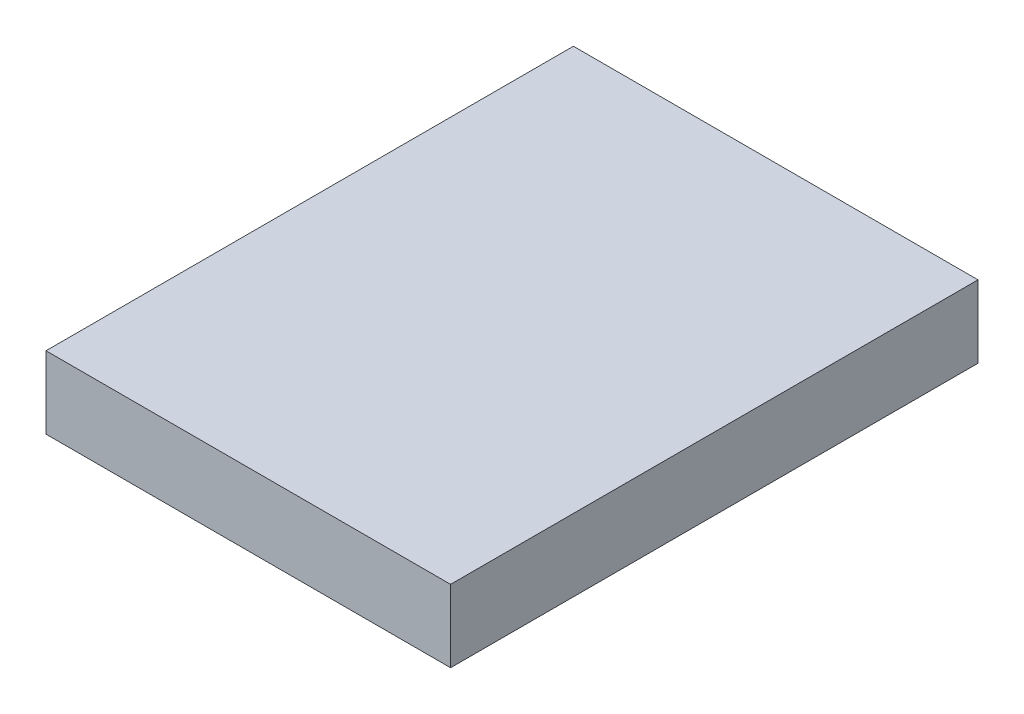
ISO-10303-21;
HEADER;
FILE_DESCRIPTION(('STEP AP214'),'2;1');
FILE_NAME('part.step','',(''),(''),'','','');
FILE_SCHEMA(('AUTOMOTIVE_DESIGN { 1 0 10303 214 1 1 1 1 }'));
ENDSEC;
DATA;
#1=APPLICATION_CONTEXT('core data for automotive mechanical design processes');
#2=APPLICATION_PROTOCOL_DEFINITION('international standard','automotive_design',2000,#1);
#3=PRODUCT_CONTEXT('',#1,'mechanical');
#4=PRODUCT('Part','Part','',(#3));
#5=PRODUCT_RELATED_PRODUCT_CATEGORY('part','',(#4));
#6=PRODUCT_DEFINITION_FORMATION('','',#4);
#7=PRODUCT_DEFINITION_CONTEXT('part definition',#1,'design');
#8=PRODUCT_DEFINITION('design','',#6,#7);
#9=PRODUCT_DEFINITION_SHAPE('','',#8);
#10=(LENGTH_UNIT() NAMED_UNIT(*) SI_UNIT(.MILLI.,.METRE.));
#11=(NAMED_UNIT(*) PLANE_ANGLE_UNIT() SI_UNIT($,.RADIAN.));
#12=(NAMED_UNIT(*) SI_UNIT($,.STERADIAN.) SOLID_ANGLE_UNIT());
#13=UNCERTAINTY_MEASURE_WITH_UNIT(LENGTH_MEASURE(1.E-05),#10,'distance_accuracy_value','');
#14=(GEOMETRIC_REPRESENTATION_CONTEXT(3) GLOBAL_UNCERTAINTY_ASSIGNED_CONTEXT((#13)) GLOBAL_UNIT_ASSIGNED_CONTEXT((#10,
#11,#12)) REPRESENTATION_CONTEXT('',''));
#15=CARTESIAN_POINT('',(0.,0.,0.));
#16=DIRECTION('',(0.,0.,1.));
#17=DIRECTION('',(1.,0.,0.));
#18=AXIS2_PLACEMENT_3D('',#15,#16,#17);
#19=CARTESIAN_POINT('',(0.,20.,0.));
#20=DIRECTION('',(1.,0.,0.));
#21=DIRECTION('',(0.,0.,-1.));
#22=AXIS2_PLACEMENT_3D('',#19,#20,#21);
#23=PLANE('',#22);
#24=DIRECTION('',(0.,0.,1.));
#25=VECTOR('',#24,1.);
#26=CARTESIAN_POINT('',(0.,0.,0.));
#27=LINE('',#26,#25);
#28=CARTESIAN_POINT('',(0.,0.,-146.));
#29=VERTEX_POINT('',#28);
#30=CARTESIAN_POINT('',(0.,0.,0.));
#31=VERTEX_POINT('',#30);
#32=EDGE_CURVE('E113',#29,#31,#27,.T.);
#33=ORIENTED_EDGE('',*,*,#32,.T.);
#34=DIRECTION('',(0.,-1.,0.));
#35=VECTOR('',#34,1.);
#36=CARTESIAN_POINT('',(0.,20.,0.));
#37=LINE('',#36,#35);
#38=CARTESIAN_POINT('',(0.,20.,0.));
#39=VERTEX_POINT('',#38);
#40=EDGE_CURVE('E11',#39,#31,#37,.T.);
#41=ORIENTED_EDGE('',*,*,#40,.F.);
#42=DIRECTION('',(0.,0.,1.));
#43=VECTOR('',#42,1.);
#44=CARTESIAN_POINT('',(0.,20.,0.));
#45=LINE('',#44,#43);
#46=CARTESIAN_POINT('',(0.,20.,-146.));
#47=VERTEX_POINT('',#46);
#48=EDGE_CURVE('E97',#47,#39,#45,.T.);
#49=ORIENTED_EDGE('',*,*,#48,.F.);
#50=DIRECTION('',(0.,-1.,0.));
#51=VECTOR('',#50,1.);
#52=CARTESIAN_POINT('',(0.,20.,-146.));
#53=LINE('',#52,#51);
#54=EDGE_CURVE('E109',#47,#29,#53,.T.);
#55=ORIENTED_EDGE('',*,*,#54,.T.);
#56=EDGE_LOOP('',(#33,#41,#49,#55));
#57=FACE_BOUND('',#56,.T.);
#58=ADVANCED_FACE('F45',(#57),#23,.F.);
#59=CARTESIAN_POINT('',(0.,20.,0.));
#60=DIRECTION('',(0.,0.,-1.));
#61=DIRECTION('',(-1.,0.,0.));
#62=AXIS2_PLACEMENT_3D('',#59,#60,#61);
#63=PLANE('',#62);
#64=DIRECTION('',(1.,0.,0.));
#65=VECTOR('',#64,1.);
#66=CARTESIAN_POINT('',(0.,0.,0.));
#67=LINE('',#66,#65);
#68=CARTESIAN_POINT('',(112.,0.,0.));
#69=VERTEX_POINT('',#68);
#70=EDGE_CURVE('E102',#31,#69,#67,.T.);
#71=ORIENTED_EDGE('',*,*,#70,.T.);
#72=DIRECTION('',(0.,-1.,0.));
#73=VECTOR('',#72,1.);
#74=CARTESIAN_POINT('',(112.,20.,0.));
#75=LINE('',#74,#73);
#76=CARTESIAN_POINT('',(112.,20.,0.));
#77=VERTEX_POINT('',#76);
#78=EDGE_CURVE('E54',#77,#69,#75,.T.);
#79=ORIENTED_EDGE('',*,*,#78,.F.);
#80=DIRECTION('',(1.,0.,0.));
#81=VECTOR('',#80,1.);
#82=CARTESIAN_POINT('',(0.,20.,0.));
#83=LINE('',#82,#81);
#84=EDGE_CURVE('E92',#39,#77,#83,.T.);
#85=ORIENTED_EDGE('',*,*,#84,.F.);
#86=ORIENTED_EDGE('',*,*,#40,.T.);
#87=EDGE_LOOP('',(#71,#79,#85,#86));
#88=FACE_BOUND('',#87,.T.);
#89=ADVANCED_FACE('F101',(#88),#63,.F.);
#90=CARTESIAN_POINT('',(112.,20.,0.));
#91=DIRECTION('',(-1.,0.,0.));
#92=DIRECTION('',(0.,0.,1.));
#93=AXIS2_PLACEMENT_3D('',#90,#91,#92);
#94=PLANE('',#93);
#95=DIRECTION('',(0.,0.,-1.));
#96=VECTOR('',#95,1.);
#97=CARTESIAN_POINT('',(112.,0.,0.));
#98=LINE('',#97,#96);
#99=CARTESIAN_POINT('',(112.,0.,-146.));
#100=VERTEX_POINT('',#99);
#101=EDGE_CURVE('E79',#69,#100,#98,.T.);
#102=ORIENTED_EDGE('',*,*,#101,.T.);
#103=DIRECTION('',(0.,-1.,0.));
#104=VECTOR('',#103,1.);
#105=CARTESIAN_POINT('',(112.,20.,-146.));
#106=LINE('',#105,#104);
#107=CARTESIAN_POINT('',(112.,20.,-146.));
#108=VERTEX_POINT('',#107);
#109=EDGE_CURVE('E104',#108,#100,#106,.T.);
#110=ORIENTED_EDGE('',*,*,#109,.F.);
#111=DIRECTION('',(0.,0.,-1.));
#112=VECTOR('',#111,1.);
#113=CARTESIAN_POINT('',(112.,20.,0.));
#114=LINE('',#113,#112);
#115=EDGE_CURVE('E95',#77,#108,#114,.T.);
#116=ORIENTED_EDGE('',*,*,#115,.F.);
#117=ORIENTED_EDGE('',*,*,#78,.T.);
#118=EDGE_LOOP('',(#102,#110,#116,#117));
#119=FACE_BOUND('',#118,.T.);
#120=ADVANCED_FACE('F105',(#119),#94,.F.);
#121=CARTESIAN_POINT('',(0.,20.,-146.));
#122=DIRECTION('',(0.,0.,1.));
#123=DIRECTION('',(1.,0.,0.));
#124=AXIS2_PLACEMENT_3D('',#121,#122,#123);
#125=PLANE('',#124);
#126=DIRECTION('',(-1.,0.,0.));
#127=VECTOR('',#126,1.);
#128=CARTESIAN_POINT('',(0.,0.,-146.));
#129=LINE('',#128,#127);
#130=EDGE_CURVE('E85',#100,#29,#129,.T.);
#131=ORIENTED_EDGE('',*,*,#130,.T.);
#132=ORIENTED_EDGE('',*,*,#54,.F.);
#133=DIRECTION('',(-1.,0.,0.));
#134=VECTOR('',#133,1.);
#135=CARTESIAN_POINT('',(0.,20.,-146.));
#136=LINE('',#135,#134);
#137=EDGE_CURVE('E62',#108,#47,#136,.T.);
#138=ORIENTED_EDGE('',*,*,#137,.F.);
#139=ORIENTED_EDGE('',*,*,#109,.T.);
#140=EDGE_LOOP('',(#131,#132,#138,#139));
#141=FACE_BOUND('',#140,.T.);
#142=ADVANCED_FACE('F126',(#141),#125,.F.);
#143=CARTESIAN_POINT('',(0.,20.,0.));
#144=DIRECTION('',(0.,-1.,0.));
#145=DIRECTION('',(0.,0.,-1.));
#146=AXIS2_PLACEMENT_3D('',#143,#144,#145);
#147=PLANE('',#146);
#148=ORIENTED_EDGE('',*,*,#48,.T.);
#149=ORIENTED_EDGE('',*,*,#84,.T.);
#150=ORIENTED_EDGE('',*,*,#115,.T.);
#151=ORIENTED_EDGE('',*,*,#137,.T.);
#152=EDGE_LOOP('',(#148,#149,#150,#151));
#153=FACE_BOUND('',#152,.T.);
#154=ADVANCED_FACE('F93',(#153),#147,.F.);
#155=CARTESIAN_POINT('',(0.,0.,0.));
#156=DIRECTION('',(0.,-1.,0.));
#157=DIRECTION('',(0.,0.,-1.));
#158=AXIS2_PLACEMENT_3D('',#155,#156,#157);
#159=PLANE('',#158);
#160=ORIENTED_EDGE('',*,*,#32,.F.);
#161=ORIENTED_EDGE('',*,*,#130,.F.);
#162=ORIENTED_EDGE('',*,*,#101,.F.);
#163=ORIENTED_EDGE('',*,*,#70,.F.);
#164=EDGE_LOOP('',(#160,#161,#162,#163));
#165=FACE_BOUND('',#164,.T.);
#166=ADVANCED_FACE('F129',(#165),#159,.T.);
#167=CLOSED_SHELL('',(#58,#89,#120,#142,#154,#166));
#168=MANIFOLD_SOLID_BREP('B2',#167);
#169=ADVANCED_BREP_SHAPE_REPRESENTATION('',(#18,#168),#14);
#170=SHAPE_DEFINITION_REPRESENTATION(#9,#169);
ENDSEC;
END-ISO-10303-21;
